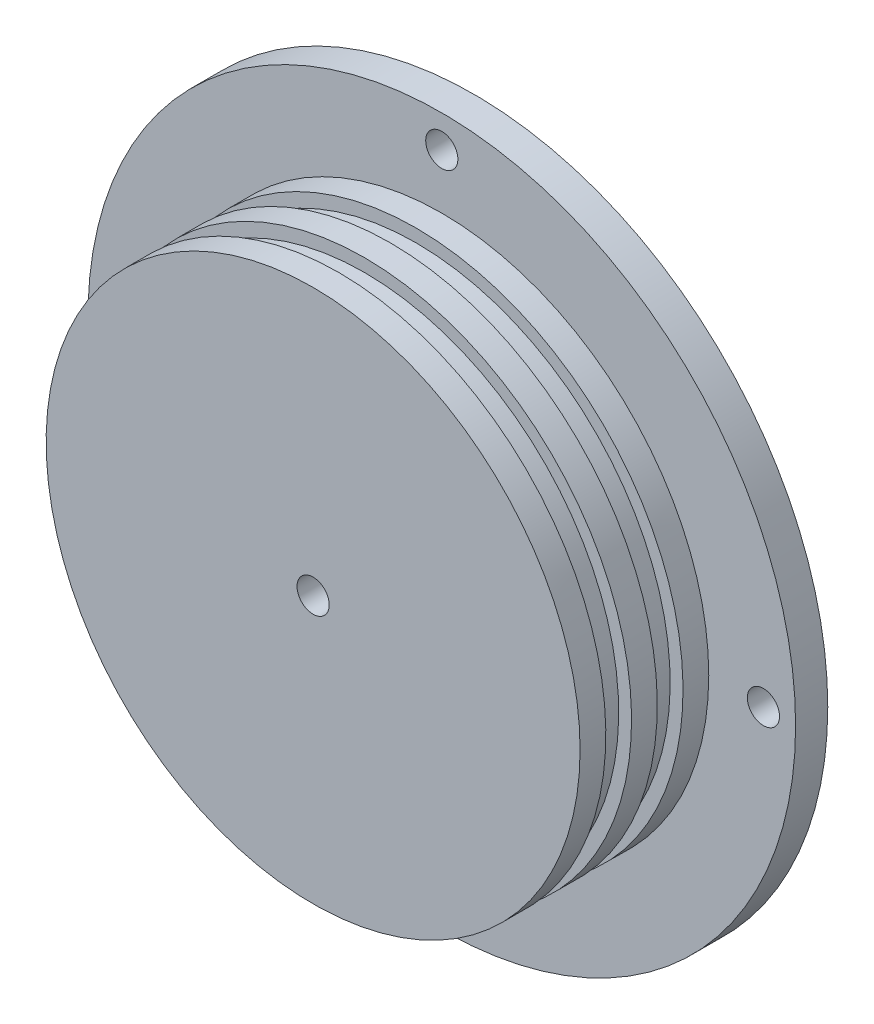
ISO-10303-21;
HEADER;
FILE_DESCRIPTION(('STEP AP214'),'2;1');
FILE_NAME('part.step','',(''),(''),'','','');
FILE_SCHEMA(('AUTOMOTIVE_DESIGN { 1 0 10303 214 1 1 1 1 }'));
ENDSEC;
DATA;
#1=APPLICATION_CONTEXT('core data for automotive mechanical design processes');
#2=APPLICATION_PROTOCOL_DEFINITION('international standard','automotive_design',2000,#1);
#3=PRODUCT_CONTEXT('',#1,'mechanical');
#4=PRODUCT('Part','Part','',(#3));
#5=PRODUCT_RELATED_PRODUCT_CATEGORY('part','',(#4));
#6=PRODUCT_DEFINITION_FORMATION('','',#4);
#7=PRODUCT_DEFINITION_CONTEXT('part definition',#1,'design');
#8=PRODUCT_DEFINITION('design','',#6,#7);
#9=PRODUCT_DEFINITION_SHAPE('','',#8);
#10=(LENGTH_UNIT() NAMED_UNIT(*) SI_UNIT(.MILLI.,.METRE.));
#11=(NAMED_UNIT(*) PLANE_ANGLE_UNIT() SI_UNIT($,.RADIAN.));
#12=(NAMED_UNIT(*) SI_UNIT($,.STERADIAN.) SOLID_ANGLE_UNIT());
#13=UNCERTAINTY_MEASURE_WITH_UNIT(LENGTH_MEASURE(1.E-05),#10,'distance_accuracy_value','');
#14=(GEOMETRIC_REPRESENTATION_CONTEXT(3) GLOBAL_UNCERTAINTY_ASSIGNED_CONTEXT((#13)) GLOBAL_UNIT_ASSIGNED_CONTEXT((#10,
#11,#12)) REPRESENTATION_CONTEXT('',''));
#15=CARTESIAN_POINT('',(0.,0.,0.));
#16=DIRECTION('',(0.,0.,1.));
#17=DIRECTION('',(1.,0.,0.));
#18=AXIS2_PLACEMENT_3D('',#15,#16,#17);
#19=CARTESIAN_POINT('',(0.,0.,25.));
#20=DIRECTION('',(0.,0.,-1.));
#21=DIRECTION('',(-1.,0.,0.));
#22=AXIS2_PLACEMENT_3D('',#19,#20,#21);
#23=CYLINDRICAL_SURFACE('',#22,2.5);
#24=CARTESIAN_POINT('',(0.,0.,25.));
#25=DIRECTION('',(0.,0.,-1.));
#26=DIRECTION('',(-1.,0.,0.));
#27=AXIS2_PLACEMENT_3D('',#24,#25,#26);
#28=CIRCLE('',#27,2.5);
#29=CARTESIAN_POINT('',(-2.5,0.,25.));
#30=VERTEX_POINT('',#29);
#31=EDGE_CURVE('E95',#30,#30,#28,.T.);
#32=ORIENTED_EDGE('',*,*,#31,.F.);
#33=EDGE_LOOP('',(#32));
#34=FACE_BOUND('',#33,.T.);
#35=CARTESIAN_POINT('',(0.,0.,10.));
#36=DIRECTION('',(0.,0.,-1.));
#37=DIRECTION('',(-1.,0.,0.));
#38=AXIS2_PLACEMENT_3D('',#35,#36,#37);
#39=CIRCLE('',#38,2.5);
#40=CARTESIAN_POINT('',(-2.5,0.,10.));
#41=VERTEX_POINT('',#40);
#42=EDGE_CURVE('E41',#41,#41,#39,.F.);
#43=ORIENTED_EDGE('',*,*,#42,.F.);
#44=EDGE_LOOP('',(#43));
#45=FACE_BOUND('',#44,.T.);
#46=ADVANCED_FACE('F37',(#34,#45),#23,.F.);
#47=CARTESIAN_POINT('',(0.,0.,25.));
#48=DIRECTION('',(0.,0.,-1.));
#49=DIRECTION('',(-1.,0.,0.));
#50=AXIS2_PLACEMENT_3D('',#47,#48,#49);
#51=CYLINDRICAL_SURFACE('',#50,41.5);
#52=CARTESIAN_POINT('',(0.,0.,9.));
#53=DIRECTION('',(0.,0.,-1.));
#54=DIRECTION('',(0.,1.,0.));
#55=AXIS2_PLACEMENT_3D('',#52,#53,#54);
#56=CIRCLE('',#55,41.5);
#57=CARTESIAN_POINT('',(0.,41.5,9.));
#58=VERTEX_POINT('',#57);
#59=EDGE_CURVE('E101',#58,#58,#56,.T.);
#60=ORIENTED_EDGE('',*,*,#59,.T.);
#61=EDGE_LOOP('',(#60));
#62=FACE_BOUND('',#61,.T.);
#63=CARTESIAN_POINT('',(0.,0.,5.));
#64=DIRECTION('',(0.,0.,1.));
#65=DIRECTION('',(1.,0.,0.));
#66=AXIS2_PLACEMENT_3D('',#63,#64,#65);
#67=CIRCLE('',#66,41.5);
#68=CARTESIAN_POINT('',(41.5,0.,5.));
#69=VERTEX_POINT('',#68);
#70=EDGE_CURVE('E76',#69,#69,#67,.T.);
#71=ORIENTED_EDGE('',*,*,#70,.T.);
#72=EDGE_LOOP('',(#71));
#73=FACE_BOUND('',#72,.T.);
#74=ADVANCED_FACE('F121',(#62,#73),#51,.T.);
#75=CARTESIAN_POINT('',(0.,0.,5.));
#76=DIRECTION('',(0.,0.,-1.));
#77=DIRECTION('',(-1.,0.,0.));
#78=AXIS2_PLACEMENT_3D('',#75,#76,#77);
#79=CYLINDRICAL_SURFACE('',#78,55.);
#80=CARTESIAN_POINT('',(0.,0.,5.));
#81=DIRECTION('',(0.,0.,1.));
#82=DIRECTION('',(1.,0.,0.));
#83=AXIS2_PLACEMENT_3D('',#80,#81,#82);
#84=CIRCLE('',#83,55.);
#85=CARTESIAN_POINT('',(55.,0.,5.));
#86=VERTEX_POINT('',#85);
#87=EDGE_CURVE('E10',#86,#86,#84,.T.);
#88=ORIENTED_EDGE('',*,*,#87,.F.);
#89=EDGE_LOOP('',(#88));
#90=FACE_BOUND('',#89,.T.);
#91=CARTESIAN_POINT('',(0.,0.,0.));
#92=DIRECTION('',(0.,0.,1.));
#93=DIRECTION('',(1.,0.,0.));
#94=AXIS2_PLACEMENT_3D('',#91,#92,#93);
#95=CIRCLE('',#94,55.);
#96=CARTESIAN_POINT('',(55.,0.,0.));
#97=VERTEX_POINT('',#96);
#98=EDGE_CURVE('E45',#97,#97,#95,.T.);
#99=ORIENTED_EDGE('',*,*,#98,.T.);
#100=EDGE_LOOP('',(#99));
#101=FACE_BOUND('',#100,.T.);
#102=ADVANCED_FACE('F39',(#90,#101),#79,.T.);
#103=CARTESIAN_POINT('',(0.,0.,5.));
#104=DIRECTION('',(0.,0.,1.));
#105=DIRECTION('',(1.,0.,0.));
#106=AXIS2_PLACEMENT_3D('',#103,#104,#105);
#107=PLANE('',#106);
#108=ORIENTED_EDGE('',*,*,#70,.F.);
#109=EDGE_LOOP('',(#108));
#110=FACE_BOUND('',#109,.T.);
#111=CARTESIAN_POINT('',(-50.,-1.74574066942157E-13,5.));
#112=DIRECTION('',(0.,0.,-1.));
#113=DIRECTION('',(0.,-1.,0.));
#114=AXIS2_PLACEMENT_3D('',#111,#112,#113);
#115=CIRCLE('',#114,2.5);
#116=CARTESIAN_POINT('',(-50.,-2.50000000000018,5.));
#117=VERTEX_POINT('',#116);
#118=EDGE_CURVE('E55',#117,#117,#115,.T.);
#119=ORIENTED_EDGE('',*,*,#118,.T.);
#120=EDGE_LOOP('',(#119));
#121=FACE_BOUND('',#120,.T.);
#122=CARTESIAN_POINT('',(0.,-50.,5.));
#123=DIRECTION('',(0.,0.,-1.));
#124=DIRECTION('',(1.,0.,0.));
#125=AXIS2_PLACEMENT_3D('',#122,#123,#124);
#126=CIRCLE('',#125,2.5);
#127=CARTESIAN_POINT('',(2.5,-50.,5.));
#128=VERTEX_POINT('',#127);
#129=EDGE_CURVE('E68',#128,#128,#126,.T.);
#130=ORIENTED_EDGE('',*,*,#129,.T.);
#131=EDGE_LOOP('',(#130));
#132=FACE_BOUND('',#131,.T.);
#133=CARTESIAN_POINT('',(50.,5.2372220082647E-13,5.));
#134=DIRECTION('',(0.,0.,-1.));
#135=DIRECTION('',(0.,1.,0.));
#136=AXIS2_PLACEMENT_3D('',#133,#134,#135);
#137=CIRCLE('',#136,2.5);
#138=CARTESIAN_POINT('',(50.,2.50000000000053,5.));
#139=VERTEX_POINT('',#138);
#140=EDGE_CURVE('E61',#139,#139,#137,.T.);
#141=ORIENTED_EDGE('',*,*,#140,.T.);
#142=EDGE_LOOP('',(#141));
#143=FACE_BOUND('',#142,.T.);
#144=CARTESIAN_POINT('',(0.,50.,5.));
#145=DIRECTION('',(0.,0.,-1.));
#146=DIRECTION('',(-1.,0.,0.));
#147=AXIS2_PLACEMENT_3D('',#144,#145,#146);
#148=CIRCLE('',#147,2.5);
#149=CARTESIAN_POINT('',(-2.5,50.,5.));
#150=VERTEX_POINT('',#149);
#151=EDGE_CURVE('E50',#150,#150,#148,.T.);
#152=ORIENTED_EDGE('',*,*,#151,.T.);
#153=EDGE_LOOP('',(#152));
#154=FACE_BOUND('',#153,.T.);
#155=ORIENTED_EDGE('',*,*,#87,.T.);
#156=EDGE_LOOP('',(#155));
#157=FACE_BOUND('',#156,.T.);
#158=ADVANCED_FACE('F183',(#110,#121,#132,#143,#154,#157),#107,.T.);
#159=CARTESIAN_POINT('',(0.,0.,0.));
#160=DIRECTION('',(0.,0.,1.));
#161=DIRECTION('',(1.,0.,0.));
#162=AXIS2_PLACEMENT_3D('',#159,#160,#161);
#163=PLANE('',#162);
#164=CARTESIAN_POINT('',(0.,0.,0.));
#165=DIRECTION('',(0.,0.,-1.));
#166=DIRECTION('',(-1.,0.,0.));
#167=AXIS2_PLACEMENT_3D('',#164,#165,#166);
#168=CIRCLE('',#167,20.);
#169=CARTESIAN_POINT('',(-20.,0.,0.));
#170=VERTEX_POINT('',#169);
#171=EDGE_CURVE('E108',#170,#170,#168,.T.);
#172=ORIENTED_EDGE('',*,*,#171,.F.);
#173=EDGE_LOOP('',(#172));
#174=FACE_BOUND('',#173,.T.);
#175=CARTESIAN_POINT('',(-50.,-1.74574066942157E-13,0.));
#176=DIRECTION('',(0.,0.,-1.));
#177=DIRECTION('',(0.,-1.,0.));
#178=AXIS2_PLACEMENT_3D('',#175,#176,#177);
#179=CIRCLE('',#178,2.5);
#180=CARTESIAN_POINT('',(-50.,-2.50000000000018,0.));
#181=VERTEX_POINT('',#180);
#182=EDGE_CURVE('E71',#181,#181,#179,.T.);
#183=ORIENTED_EDGE('',*,*,#182,.F.);
#184=EDGE_LOOP('',(#183));
#185=FACE_BOUND('',#184,.T.);
#186=CARTESIAN_POINT('',(0.,-50.,0.));
#187=DIRECTION('',(0.,0.,-1.));
#188=DIRECTION('',(1.,0.,0.));
#189=AXIS2_PLACEMENT_3D('',#186,#187,#188);
#190=CIRCLE('',#189,2.5);
#191=CARTESIAN_POINT('',(2.5,-50.,0.));
#192=VERTEX_POINT('',#191);
#193=EDGE_CURVE('E65',#192,#192,#190,.T.);
#194=ORIENTED_EDGE('',*,*,#193,.F.);
#195=EDGE_LOOP('',(#194));
#196=FACE_BOUND('',#195,.T.);
#197=CARTESIAN_POINT('',(50.,5.2372220082647E-13,0.));
#198=DIRECTION('',(0.,0.,-1.));
#199=DIRECTION('',(0.,1.,0.));
#200=AXIS2_PLACEMENT_3D('',#197,#198,#199);
#201=CIRCLE('',#200,2.5);
#202=CARTESIAN_POINT('',(50.,2.50000000000053,0.));
#203=VERTEX_POINT('',#202);
#204=EDGE_CURVE('E58',#203,#203,#201,.T.);
#205=ORIENTED_EDGE('',*,*,#204,.F.);
#206=EDGE_LOOP('',(#205));
#207=FACE_BOUND('',#206,.T.);
#208=CARTESIAN_POINT('',(0.,50.,0.));
#209=DIRECTION('',(0.,0.,-1.));
#210=DIRECTION('',(-1.,0.,0.));
#211=AXIS2_PLACEMENT_3D('',#208,#209,#210);
#212=CIRCLE('',#211,2.5);
#213=CARTESIAN_POINT('',(-2.5,50.,0.));
#214=VERTEX_POINT('',#213);
#215=EDGE_CURVE('E52',#214,#214,#212,.T.);
#216=ORIENTED_EDGE('',*,*,#215,.F.);
#217=EDGE_LOOP('',(#216));
#218=FACE_BOUND('',#217,.T.);
#219=ORIENTED_EDGE('',*,*,#98,.F.);
#220=EDGE_LOOP('',(#219));
#221=FACE_BOUND('',#220,.T.);
#222=ADVANCED_FACE('F181',(#174,#185,#196,#207,#218,#221),#163,.F.);
#223=CARTESIAN_POINT('',(0.,50.,5.));
#224=DIRECTION('',(0.,0.,-1.));
#225=DIRECTION('',(-1.,0.,0.));
#226=AXIS2_PLACEMENT_3D('',#223,#224,#225);
#227=CYLINDRICAL_SURFACE('',#226,2.5);
#228=ORIENTED_EDGE('',*,*,#151,.F.);
#229=EDGE_LOOP('',(#228));
#230=FACE_BOUND('',#229,.T.);
#231=ORIENTED_EDGE('',*,*,#215,.T.);
#232=EDGE_LOOP('',(#231));
#233=FACE_BOUND('',#232,.T.);
#234=ADVANCED_FACE('F177',(#230,#233),#227,.F.);
#235=CARTESIAN_POINT('',(50.,5.2372220082647E-13,5.));
#236=DIRECTION('',(0.,0.,-1.));
#237=DIRECTION('',(-1.,0.,0.));
#238=AXIS2_PLACEMENT_3D('',#235,#236,#237);
#239=CYLINDRICAL_SURFACE('',#238,2.5);
#240=ORIENTED_EDGE('',*,*,#140,.F.);
#241=EDGE_LOOP('',(#240));
#242=FACE_BOUND('',#241,.T.);
#243=ORIENTED_EDGE('',*,*,#204,.T.);
#244=EDGE_LOOP('',(#243));
#245=FACE_BOUND('',#244,.T.);
#246=ADVANCED_FACE('F173',(#242,#245),#239,.F.);
#247=CARTESIAN_POINT('',(0.,-50.,5.));
#248=DIRECTION('',(0.,0.,-1.));
#249=DIRECTION('',(-1.,0.,0.));
#250=AXIS2_PLACEMENT_3D('',#247,#248,#249);
#251=CYLINDRICAL_SURFACE('',#250,2.5);
#252=ORIENTED_EDGE('',*,*,#129,.F.);
#253=EDGE_LOOP('',(#252));
#254=FACE_BOUND('',#253,.T.);
#255=ORIENTED_EDGE('',*,*,#193,.T.);
#256=EDGE_LOOP('',(#255));
#257=FACE_BOUND('',#256,.T.);
#258=ADVANCED_FACE('F169',(#254,#257),#251,.F.);
#259=CARTESIAN_POINT('',(-50.,-1.74574066942157E-13,5.));
#260=DIRECTION('',(0.,0.,-1.));
#261=DIRECTION('',(-1.,0.,0.));
#262=AXIS2_PLACEMENT_3D('',#259,#260,#261);
#263=CYLINDRICAL_SURFACE('',#262,2.5);
#264=ORIENTED_EDGE('',*,*,#118,.F.);
#265=EDGE_LOOP('',(#264));
#266=FACE_BOUND('',#265,.T.);
#267=ORIENTED_EDGE('',*,*,#182,.T.);
#268=EDGE_LOOP('',(#267));
#269=FACE_BOUND('',#268,.T.);
#270=ADVANCED_FACE('F147',(#266,#269),#263,.F.);
#271=CARTESIAN_POINT('',(0.,41.5,13.));
#272=DIRECTION('',(0.,0.,1.));
#273=DIRECTION('',(0.,-1.,0.));
#274=AXIS2_PLACEMENT_3D('',#271,#272,#273);
#275=PLANE('',#274);
#276=CARTESIAN_POINT('',(0.,0.,13.));
#277=DIRECTION('',(0.,0.,-1.));
#278=DIRECTION('',(0.,1.,0.));
#279=AXIS2_PLACEMENT_3D('',#276,#277,#278);
#280=CIRCLE('',#279,39.5);
#281=CARTESIAN_POINT('',(0.,39.5,13.));
#282=VERTEX_POINT('',#281);
#283=EDGE_CURVE('E79',#282,#282,#280,.T.);
#284=ORIENTED_EDGE('',*,*,#283,.F.);
#285=EDGE_LOOP('',(#284));
#286=FACE_BOUND('',#285,.T.);
#287=CARTESIAN_POINT('',(0.,0.,13.));
#288=DIRECTION('',(0.,0.,-1.));
#289=DIRECTION('',(0.,1.,0.));
#290=AXIS2_PLACEMENT_3D('',#287,#288,#289);
#291=CIRCLE('',#290,41.5);
#292=CARTESIAN_POINT('',(0.,41.5,13.));
#293=VERTEX_POINT('',#292);
#294=EDGE_CURVE('E85',#293,#293,#291,.T.);
#295=ORIENTED_EDGE('',*,*,#294,.T.);
#296=EDGE_LOOP('',(#295));
#297=FACE_BOUND('',#296,.T.);
#298=ADVANCED_FACE('F143',(#286,#297),#275,.F.);
#299=CARTESIAN_POINT('',(0.,0.,0.));
#300=DIRECTION('',(0.,0.,-1.));
#301=DIRECTION('',(0.,1.,0.));
#302=AXIS2_PLACEMENT_3D('',#299,#300,#301);
#303=CYLINDRICAL_SURFACE('',#302,39.5);
#304=CARTESIAN_POINT('',(0.,0.,9.));
#305=DIRECTION('',(0.,0.,-1.));
#306=DIRECTION('',(0.,1.,0.));
#307=AXIS2_PLACEMENT_3D('',#304,#305,#306);
#308=CIRCLE('',#307,39.5);
#309=CARTESIAN_POINT('',(0.,39.5,9.));
#310=VERTEX_POINT('',#309);
#311=EDGE_CURVE('E98',#310,#310,#308,.T.);
#312=ORIENTED_EDGE('',*,*,#311,.F.);
#313=EDGE_LOOP('',(#312));
#314=FACE_BOUND('',#313,.T.);
#315=ORIENTED_EDGE('',*,*,#283,.T.);
#316=EDGE_LOOP('',(#315));
#317=FACE_BOUND('',#316,.T.);
#318=ADVANCED_FACE('F139',(#314,#317),#303,.T.);
#319=CARTESIAN_POINT('',(0.,41.5,9.));
#320=DIRECTION('',(0.,0.,-1.));
#321=DIRECTION('',(0.,1.,0.));
#322=AXIS2_PLACEMENT_3D('',#319,#320,#321);
#323=PLANE('',#322);
#324=ORIENTED_EDGE('',*,*,#59,.F.);
#325=EDGE_LOOP('',(#324));
#326=FACE_BOUND('',#325,.T.);
#327=ORIENTED_EDGE('',*,*,#311,.T.);
#328=EDGE_LOOP('',(#327));
#329=FACE_BOUND('',#328,.T.);
#330=ADVANCED_FACE('F136',(#326,#329),#323,.F.);
#331=ORIENTED_EDGE('',*,*,#294,.F.);
#332=EDGE_LOOP('',(#331));
#333=FACE_BOUND('',#332,.T.);
#334=CARTESIAN_POINT('',(0.,0.,17.));
#335=DIRECTION('',(0.,0.,-1.));
#336=DIRECTION('',(0.,1.,0.));
#337=AXIS2_PLACEMENT_3D('',#334,#335,#336);
#338=CIRCLE('',#337,41.5);
#339=CARTESIAN_POINT('',(0.,41.5,17.));
#340=VERTEX_POINT('',#339);
#341=EDGE_CURVE('E82',#340,#340,#338,.T.);
#342=ORIENTED_EDGE('',*,*,#341,.T.);
#343=EDGE_LOOP('',(#342));
#344=FACE_BOUND('',#343,.T.);
#345=ADVANCED_FACE('F130',(#333,#344),#51,.T.);
#346=CARTESIAN_POINT('',(0.,41.5,17.));
#347=DIRECTION('',(0.,0.,-1.));
#348=DIRECTION('',(0.,1.,0.));
#349=AXIS2_PLACEMENT_3D('',#346,#347,#348);
#350=PLANE('',#349);
#351=ORIENTED_EDGE('',*,*,#341,.F.);
#352=EDGE_LOOP('',(#351));
#353=FACE_BOUND('',#352,.T.);
#354=CARTESIAN_POINT('',(0.,0.,17.));
#355=DIRECTION('',(0.,0.,-1.));
#356=DIRECTION('',(0.,1.,0.));
#357=AXIS2_PLACEMENT_3D('',#354,#355,#356);
#358=CIRCLE('',#357,39.5);
#359=CARTESIAN_POINT('',(0.,39.5,17.));
#360=VERTEX_POINT('',#359);
#361=EDGE_CURVE('E86',#360,#360,#358,.T.);
#362=ORIENTED_EDGE('',*,*,#361,.T.);
#363=EDGE_LOOP('',(#362));
#364=FACE_BOUND('',#363,.T.);
#365=ADVANCED_FACE('F157',(#353,#364),#350,.F.);
#366=CARTESIAN_POINT('',(0.,0.,0.));
#367=DIRECTION('',(0.,0.,-1.));
#368=DIRECTION('',(0.,1.,0.));
#369=AXIS2_PLACEMENT_3D('',#366,#367,#368);
#370=CYLINDRICAL_SURFACE('',#369,39.5);
#371=ORIENTED_EDGE('',*,*,#361,.F.);
#372=EDGE_LOOP('',(#371));
#373=FACE_BOUND('',#372,.T.);
#374=CARTESIAN_POINT('',(0.,0.,21.));
#375=DIRECTION('',(0.,0.,-1.));
#376=DIRECTION('',(0.,1.,0.));
#377=AXIS2_PLACEMENT_3D('',#374,#375,#376);
#378=CIRCLE('',#377,39.5);
#379=CARTESIAN_POINT('',(0.,39.5,21.));
#380=VERTEX_POINT('',#379);
#381=EDGE_CURVE('E89',#380,#380,#378,.T.);
#382=ORIENTED_EDGE('',*,*,#381,.T.);
#383=EDGE_LOOP('',(#382));
#384=FACE_BOUND('',#383,.T.);
#385=ADVANCED_FACE('F153',(#373,#384),#370,.T.);
#386=CARTESIAN_POINT('',(0.,41.5,21.));
#387=DIRECTION('',(0.,0.,1.));
#388=DIRECTION('',(0.,-1.,0.));
#389=AXIS2_PLACEMENT_3D('',#386,#387,#388);
#390=PLANE('',#389);
#391=ORIENTED_EDGE('',*,*,#381,.F.);
#392=EDGE_LOOP('',(#391));
#393=FACE_BOUND('',#392,.T.);
#394=CARTESIAN_POINT('',(0.,0.,21.));
#395=DIRECTION('',(0.,0.,-1.));
#396=DIRECTION('',(0.,1.,0.));
#397=AXIS2_PLACEMENT_3D('',#394,#395,#396);
#398=CIRCLE('',#397,41.5);
#399=CARTESIAN_POINT('',(0.,41.5,21.));
#400=VERTEX_POINT('',#399);
#401=EDGE_CURVE('E92',#400,#400,#398,.T.);
#402=ORIENTED_EDGE('',*,*,#401,.T.);
#403=EDGE_LOOP('',(#402));
#404=FACE_BOUND('',#403,.T.);
#405=ADVANCED_FACE('F149',(#393,#404),#390,.F.);
#406=CARTESIAN_POINT('',(0.,0.,25.));
#407=DIRECTION('',(0.,0.,1.));
#408=DIRECTION('',(1.,0.,0.));
#409=AXIS2_PLACEMENT_3D('',#406,#407,#408);
#410=PLANE('',#409);
#411=ORIENTED_EDGE('',*,*,#31,.T.);
#412=EDGE_LOOP('',(#411));
#413=FACE_BOUND('',#412,.T.);
#414=CARTESIAN_POINT('',(0.,0.,25.));
#415=DIRECTION('',(0.,0.,1.));
#416=DIRECTION('',(1.,0.,0.));
#417=AXIS2_PLACEMENT_3D('',#414,#415,#416);
#418=CIRCLE('',#417,41.5);
#419=CARTESIAN_POINT('',(41.5,0.,25.));
#420=VERTEX_POINT('',#419);
#421=EDGE_CURVE('E62',#420,#420,#418,.T.);
#422=ORIENTED_EDGE('',*,*,#421,.T.);
#423=EDGE_LOOP('',(#422));
#424=FACE_BOUND('',#423,.T.);
#425=ADVANCED_FACE('F152',(#413,#424),#410,.T.);
#426=ORIENTED_EDGE('',*,*,#401,.F.);
#427=EDGE_LOOP('',(#426));
#428=FACE_BOUND('',#427,.T.);
#429=ORIENTED_EDGE('',*,*,#421,.F.);
#430=EDGE_LOOP('',(#429));
#431=FACE_BOUND('',#430,.T.);
#432=ADVANCED_FACE('F129',(#428,#431),#51,.T.);
#433=CARTESIAN_POINT('',(0.,0.,10.));
#434=DIRECTION('',(0.,0.,-1.));
#435=DIRECTION('',(-1.,0.,0.));
#436=AXIS2_PLACEMENT_3D('',#433,#434,#435);
#437=PLANE('',#436);
#438=CARTESIAN_POINT('',(0.,0.,10.));
#439=DIRECTION('',(0.,0.,-1.));
#440=DIRECTION('',(-1.,0.,0.));
#441=AXIS2_PLACEMENT_3D('',#438,#439,#440);
#442=CIRCLE('',#441,20.);
#443=CARTESIAN_POINT('',(-20.,0.,10.));
#444=VERTEX_POINT('',#443);
#445=EDGE_CURVE('E111',#444,#444,#442,.T.);
#446=ORIENTED_EDGE('',*,*,#445,.T.);
#447=EDGE_LOOP('',(#446));
#448=FACE_BOUND('',#447,.T.);
#449=ORIENTED_EDGE('',*,*,#42,.T.);
#450=EDGE_LOOP('',(#449));
#451=FACE_BOUND('',#450,.T.);
#452=ADVANCED_FACE('F118',(#448,#451),#437,.T.);
#453=CARTESIAN_POINT('',(0.,0.,10.));
#454=DIRECTION('',(0.,0.,-1.));
#455=DIRECTION('',(-1.,0.,0.));
#456=AXIS2_PLACEMENT_3D('',#453,#454,#455);
#457=CYLINDRICAL_SURFACE('',#456,20.);
#458=ORIENTED_EDGE('',*,*,#445,.F.);
#459=EDGE_LOOP('',(#458));
#460=FACE_BOUND('',#459,.T.);
#461=ORIENTED_EDGE('',*,*,#171,.T.);
#462=EDGE_LOOP('',(#461));
#463=FACE_BOUND('',#462,.T.);
#464=ADVANCED_FACE('F134',(#460,#463),#457,.F.);
#465=CLOSED_SHELL('',(#46,#74,#102,#158,#222,#234,#246,#258,#270,#298,#318,#330,#345,#365,#385,
#405,#425,#432,#452,#464));
#466=MANIFOLD_SOLID_BREP('B2',#465);
#467=ADVANCED_BREP_SHAPE_REPRESENTATION('',(#18,#466),#14);
#468=SHAPE_DEFINITION_REPRESENTATION(#9,#467);
ENDSEC;
END-ISO-10303-21;
